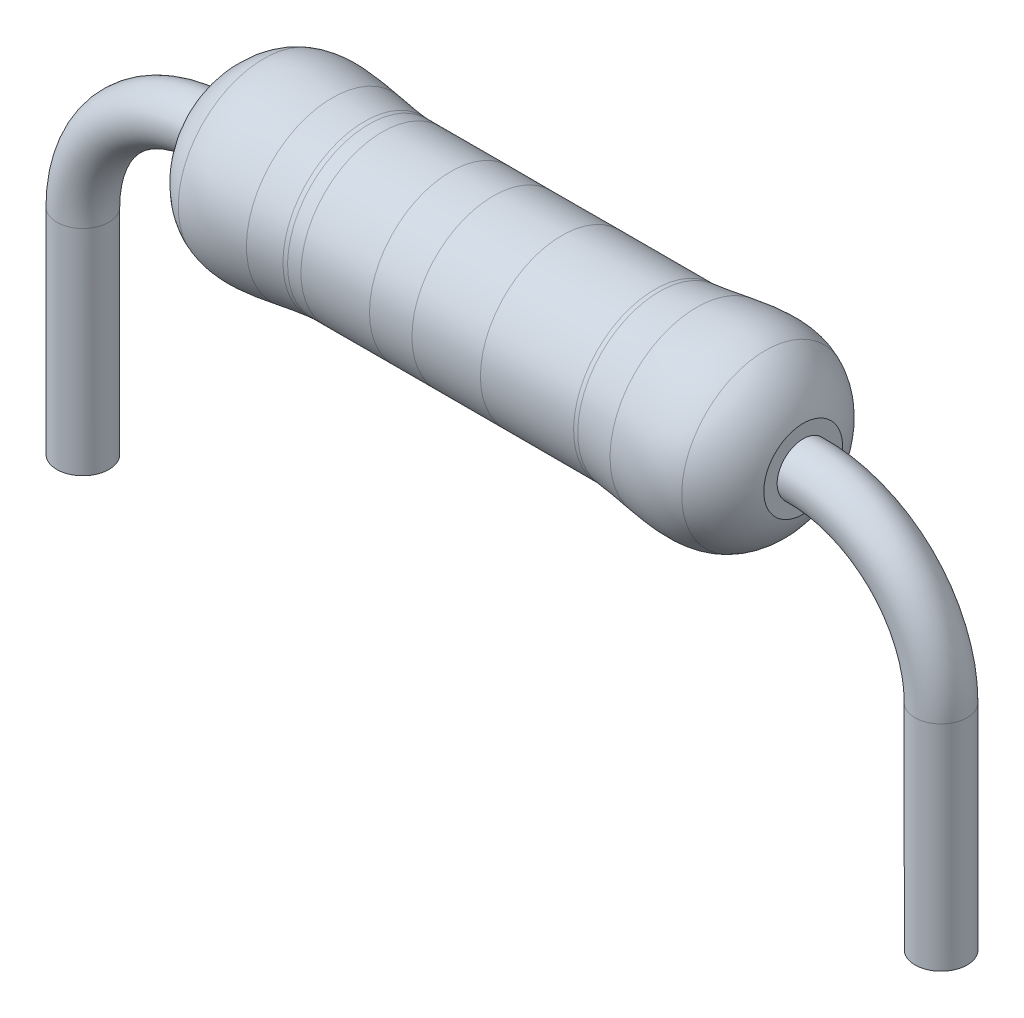
ISO-10303-21;
HEADER;
FILE_DESCRIPTION(('STEP AP214'),'2;1');
FILE_NAME('part.step','',(''),(''),'','','');
FILE_SCHEMA(('AUTOMOTIVE_DESIGN { 1 0 10303 214 1 1 1 1 }'));
ENDSEC;
DATA;
#1=APPLICATION_CONTEXT('core data for automotive mechanical design processes');
#2=APPLICATION_PROTOCOL_DEFINITION('international standard','automotive_design',2000,#1);
#3=PRODUCT_CONTEXT('',#1,'mechanical');
#4=PRODUCT('Part','Part','',(#3));
#5=PRODUCT_RELATED_PRODUCT_CATEGORY('part','',(#4));
#6=PRODUCT_DEFINITION_FORMATION('','',#4);
#7=PRODUCT_DEFINITION_CONTEXT('part definition',#1,'design');
#8=PRODUCT_DEFINITION('design','',#6,#7);
#9=PRODUCT_DEFINITION_SHAPE('','',#8);
#10=(LENGTH_UNIT() NAMED_UNIT(*) SI_UNIT(.MILLI.,.METRE.));
#11=(NAMED_UNIT(*) PLANE_ANGLE_UNIT() SI_UNIT($,.RADIAN.));
#12=(NAMED_UNIT(*) SI_UNIT($,.STERADIAN.) SOLID_ANGLE_UNIT());
#13=UNCERTAINTY_MEASURE_WITH_UNIT(LENGTH_MEASURE(1.E-05),#10,'distance_accuracy_value','');
#14=(GEOMETRIC_REPRESENTATION_CONTEXT(3) GLOBAL_UNCERTAINTY_ASSIGNED_CONTEXT((#13)) GLOBAL_UNIT_ASSIGNED_CONTEXT((#10,
#11,#12)) REPRESENTATION_CONTEXT('',''));
#15=CARTESIAN_POINT('',(0.,0.,0.));
#16=DIRECTION('',(0.,0.,1.));
#17=DIRECTION('',(1.,0.,0.));
#18=AXIS2_PLACEMENT_3D('',#15,#16,#17);
#19=CARTESIAN_POINT('',(-5.00892591003059,-4.05984695559979,0.));
#20=DIRECTION('',(-0.000226892800815695,0.999999974259828,0.));
#21=DIRECTION('',(-0.999999974259828,-0.000226892800815695,0.));
#22=AXIS2_PLACEMENT_3D('',#19,#20,#21);
#23=CYLINDRICAL_SURFACE('',#22,0.3045);
#24=CARTESIAN_POINT('',(-5.00949314203263,-1.55984701995021,0.));
#25=DIRECTION('',(-0.000226892800815696,0.999999974259828,0.));
#26=DIRECTION('',(-0.999999974259828,-0.000226892800815696,0.));
#27=AXIS2_PLACEMENT_3D('',#24,#25,#26);
#28=CIRCLE('',#27,0.3045);
#29=CARTESIAN_POINT('',(-5.31399313419475,-1.55991610880806,0.));
#30=VERTEX_POINT('',#29);
#31=EDGE_CURVE('E13',#30,#30,#28,.T.);
#32=ORIENTED_EDGE('',*,*,#31,.F.);
#33=EDGE_LOOP('',(#32));
#34=FACE_BOUND('',#33,.T.);
#35=CARTESIAN_POINT('',(-5.00892591003059,-4.05984695559979,0.));
#36=DIRECTION('',(0.000226892800815695,-0.999999974259828,0.));
#37=DIRECTION('',(0.999999974259828,0.000226892800815695,0.));
#38=AXIS2_PLACEMENT_3D('',#35,#36,#37);
#39=CIRCLE('',#38,0.3045);
#40=CARTESIAN_POINT('',(-4.70442591786848,-4.05977786674194,0.));
#41=VERTEX_POINT('',#40);
#42=EDGE_CURVE('E113',#41,#41,#39,.T.);
#43=ORIENTED_EDGE('',*,*,#42,.F.);
#44=EDGE_LOOP('',(#43));
#45=FACE_BOUND('',#44,.T.);
#46=ADVANCED_FACE('F101',(#34,#45),#23,.T.);
#47=CARTESIAN_POINT('',(-3.45,-1.55949318217426,0.));
#48=DIRECTION('',(0.,0.,-1.));
#49=DIRECTION('',(0.,1.,0.));
#50=AXIS2_PLACEMENT_3D('',#47,#48,#49);
#51=TOROIDAL_SURFACE('',#50,1.55949318217426,0.3045);
#52=CARTESIAN_POINT('',(-3.40000856583057,-0.000801473799033381,0.));
#53=DIRECTION('',(-0.999486067776253,0.0320562056576163,0.));
#54=DIRECTION('',(-0.0320562056576163,-0.999486067776253,0.));
#55=AXIS2_PLACEMENT_3D('',#52,#53,#54);
#56=CIRCLE('',#55,0.3045);
#57=CARTESIAN_POINT('',(-3.39024745120783,0.303542033838836,0.));
#58=VERTEX_POINT('',#57);
#59=EDGE_CURVE('E105',#58,#58,#56,.T.);
#60=CARTESIAN_POINT('',(-3.45,-1.55949318217426,0.));
#61=DIRECTION('',(0.,0.,-1.));
#62=DIRECTION('',(0.,1.,0.));
#63=AXIS2_PLACEMENT_3D('',#60,#61,#62);
#64=CIRCLE('',#63,1.86399318217426);
#65=EDGE_CURVE('',#30,#58,#64,.T.);
#66=ORIENTED_EDGE('',*,*,#31,.T.);
#67=ORIENTED_EDGE('',*,*,#59,.T.);
#68=ORIENTED_EDGE('',*,*,#65,.T.);
#69=ORIENTED_EDGE('',*,*,#65,.F.);
#70=EDGE_LOOP('',(#66,#68,#67,#69));
#71=FACE_BOUND('',#70,.T.);
#72=ADVANCED_FACE('F122',(#71),#51,.T.);
#73=CARTESIAN_POINT('',(-5.00892591003059,-4.05984695559979,0.));
#74=DIRECTION('',(0.000226892800815695,-0.999999974259828,0.));
#75=DIRECTION('',(0.999999974259828,0.000226892800815695,0.));
#76=AXIS2_PLACEMENT_3D('',#73,#74,#75);
#77=PLANE('',#76);
#78=ORIENTED_EDGE('',*,*,#42,.T.);
#79=EDGE_LOOP('',(#78));
#80=FACE_BOUND('',#79,.T.);
#81=ADVANCED_FACE('F119',(#80),#77,.T.);
#82=CARTESIAN_POINT('',(-3.40000856583057,-0.000801473799033381,0.));
#83=DIRECTION('',(-0.999486067776253,0.0320562056576163,0.));
#84=DIRECTION('',(-0.0320562056576163,-0.999486067776253,0.));
#85=AXIS2_PLACEMENT_3D('',#82,#83,#84);
#86=PLANE('',#85);
#87=ORIENTED_EDGE('',*,*,#59,.F.);
#88=EDGE_LOOP('',(#87));
#89=FACE_BOUND('',#88,.T.);
#90=ADVANCED_FACE('F103',(#89),#86,.F.);
#91=CLOSED_SHELL('',(#46,#72,#81,#90));
#92=MANIFOLD_SOLID_BREP('B2',#91);
#93=CARTESIAN_POINT('',(3.45,-1.56000270946096,0.));
#94=DIRECTION('',(0.,0.,-1.));
#95=DIRECTION('',(0.,1.,0.));
#96=AXIS2_PLACEMENT_3D('',#93,#94,#95);
#97=TOROIDAL_SURFACE('',#96,1.56000270946096,0.3045);
#98=CARTESIAN_POINT('',(3.40000856023624,-0.000801212066898596,0.));
#99=DIRECTION('',(0.999486403413251,0.0320457390622326,0.));
#100=DIRECTION('',(-0.0320457390622326,0.999486403413251,0.));
#101=AXIS2_PLACEMENT_3D('',#98,#99,#100);
#102=CIRCLE('',#101,0.3045);
#103=CARTESIAN_POINT('',(3.39025063269179,0.303542397772436,0.));
#104=VERTEX_POINT('',#103);
#105=EDGE_CURVE('E175',#104,#104,#102,.T.);
#106=CARTESIAN_POINT('',(5.01000264555553,-1.55955618365569,0.));
#107=DIRECTION('',(0.000286233993415575,-0.99999995903505,0.));
#108=DIRECTION('',(0.99999995903505,0.000286233993415575,0.));
#109=AXIS2_PLACEMENT_3D('',#106,#107,#108);
#110=CIRCLE('',#109,0.3045);
#111=CARTESIAN_POINT('',(5.3145026330817,-1.5594690254047,0.));
#112=VERTEX_POINT('',#111);
#113=EDGE_CURVE('E100',#112,#112,#110,.T.);
#114=CARTESIAN_POINT('',(3.45,-1.56000270946096,0.));
#115=DIRECTION('',(0.,0.,-1.));
#116=DIRECTION('',(0.,1.,0.));
#117=AXIS2_PLACEMENT_3D('',#114,#115,#116);
#118=CIRCLE('',#117,1.86450270946096);
#119=EDGE_CURVE('',#104,#112,#118,.T.);
#120=ORIENTED_EDGE('',*,*,#105,.T.);
#121=ORIENTED_EDGE('',*,*,#113,.F.);
#122=ORIENTED_EDGE('',*,*,#119,.T.);
#123=ORIENTED_EDGE('',*,*,#119,.F.);
#124=EDGE_LOOP('',(#120,#122,#121,#123));
#125=FACE_BOUND('',#124,.T.);
#126=ADVANCED_FACE('F171',(#125),#97,.T.);
#127=CARTESIAN_POINT('',(5.01071823053907,-4.05955608124332,0.));
#128=DIRECTION('',(-0.000286233993415575,0.99999995903505,0.));
#129=DIRECTION('',(-0.99999995903505,-0.000286233993415575,0.));
#130=AXIS2_PLACEMENT_3D('',#127,#128,#129);
#131=CYLINDRICAL_SURFACE('',#130,0.3045);
#132=ORIENTED_EDGE('',*,*,#113,.T.);
#133=EDGE_LOOP('',(#132));
#134=FACE_BOUND('',#133,.T.);
#135=CARTESIAN_POINT('',(5.01071823053907,-4.05955608124332,0.));
#136=DIRECTION('',(0.000286233993415575,-0.99999995903505,0.));
#137=DIRECTION('',(0.99999995903505,0.000286233993415575,0.));
#138=AXIS2_PLACEMENT_3D('',#135,#136,#137);
#139=CIRCLE('',#138,0.3045);
#140=CARTESIAN_POINT('',(5.31521821806524,-4.05946892299232,0.));
#141=VERTEX_POINT('',#140);
#142=EDGE_CURVE('E183',#141,#141,#139,.T.);
#143=ORIENTED_EDGE('',*,*,#142,.F.);
#144=EDGE_LOOP('',(#143));
#145=FACE_BOUND('',#144,.T.);
#146=ADVANCED_FACE('F191',(#134,#145),#131,.T.);
#147=CARTESIAN_POINT('',(5.01071823053907,-4.05955608124332,0.));
#148=DIRECTION('',(0.000286233993415575,-0.99999995903505,0.));
#149=DIRECTION('',(0.99999995903505,0.000286233993415575,0.));
#150=AXIS2_PLACEMENT_3D('',#147,#148,#149);
#151=PLANE('',#150);
#152=ORIENTED_EDGE('',*,*,#142,.T.);
#153=EDGE_LOOP('',(#152));
#154=FACE_BOUND('',#153,.T.);
#155=ADVANCED_FACE('F189',(#154),#151,.T.);
#156=CARTESIAN_POINT('',(3.40000856023624,-0.000801212066898596,0.));
#157=DIRECTION('',(0.999486403413251,0.0320457390622326,0.));
#158=DIRECTION('',(-0.0320457390622326,0.999486403413251,0.));
#159=AXIS2_PLACEMENT_3D('',#156,#157,#158);
#160=PLANE('',#159);
#161=ORIENTED_EDGE('',*,*,#105,.F.);
#162=EDGE_LOOP('',(#161));
#163=FACE_BOUND('',#162,.T.);
#164=ADVANCED_FACE('F173',(#163),#160,.F.);
#165=CLOSED_SHELL('',(#126,#146,#155,#164));
#166=MANIFOLD_SOLID_BREP('B8',#165);
#167=CARTESIAN_POINT('',(3.4,0.459698721559316,0.));
#168=CARTESIAN_POINT('',(3.33480124099808,0.661458026472629,0.));
#169=CARTESIAN_POINT('',(2.9210288170177,1.17428294435679,0.));
#170=CARTESIAN_POINT('',(2.23696045473549,1.01348401585843,0.));
#171=CARTESIAN_POINT('',(1.79369150074186,0.96011017829571,0.));
#172=CARTESIAN_POINT('',(1.72057233266166,0.952609891627737,0.));
#173=B_SPLINE_CURVE_WITH_KNOTS('',3,(#167,#168,#169,#170,#171,#172),.UNSPECIFIED.,.F.,.F.,(4,1,
1,4),(0.113048735519724,0.262639928880179,0.524150914852832,0.576222934190611),.UNSPECIFIED.);
#174=CARTESIAN_POINT('',(-3.4,0.,0.));
#175=DIRECTION('',(-1.,0.,0.));
#176=AXIS1_PLACEMENT('',#174,#175);
#177=SURFACE_OF_REVOLUTION('',#173,#176);
#178=CARTESIAN_POINT('',(1.72057233266166,0.,0.));
#179=DIRECTION('',(-1.,0.,0.));
#180=DIRECTION('',(0.,-1.,0.));
#181=AXIS2_PLACEMENT_3D('',#178,#179,#180);
#182=CIRCLE('',#181,0.952609891627737);
#183=CARTESIAN_POINT('',(1.72057233266166,-0.952609891627738,0.));
#184=VERTEX_POINT('',#183);
#185=EDGE_CURVE('E294',#184,#184,#182,.T.);
#186=ORIENTED_EDGE('',*,*,#185,.F.);
#187=EDGE_LOOP('',(#186));
#188=FACE_BOUND('',#187,.T.);
#189=CARTESIAN_POINT('',(2.15639241007237,0.,0.));
#190=DIRECTION('',(-1.,0.,0.));
#191=DIRECTION('',(0.,-1.,0.));
#192=AXIS2_PLACEMENT_3D('',#189,#190,#191);
#193=CIRCLE('',#192,1.0114815434762);
#194=CARTESIAN_POINT('',(2.15639241007237,-1.0114815434762,0.));
#195=VERTEX_POINT('',#194);
#196=EDGE_CURVE('E170',#195,#195,#193,.F.);
#197=ORIENTED_EDGE('',*,*,#196,.F.);
#198=EDGE_LOOP('',(#197));
#199=FACE_BOUND('',#198,.T.);
#200=ADVANCED_FACE('F247',(#188,#199),#177,.T.);
#201=CARTESIAN_POINT('',(3.4,0.,0.));
#202=DIRECTION('',(-1.,0.,0.));
#203=DIRECTION('',(0.,-1.,0.));
#204=AXIS2_PLACEMENT_3D('',#201,#202,#203);
#205=CIRCLE('',#204,0.459698721559316);
#206=CARTESIAN_POINT('',(3.4,-0.459698721559316,0.));
#207=VERTEX_POINT('',#206);
#208=EDGE_CURVE('E291',#207,#207,#205,.T.);
#209=ORIENTED_EDGE('',*,*,#208,.T.);
#210=EDGE_LOOP('',(#209));
#211=FACE_BOUND('',#210,.T.);
#212=CARTESIAN_POINT('',(2.95639241007237,0.,0.));
#213=DIRECTION('',(-1.,0.,0.));
#214=DIRECTION('',(0.,-1.,0.));
#215=AXIS2_PLACEMENT_3D('',#212,#213,#214);
#216=CIRCLE('',#215,0.974379803430076);
#217=CARTESIAN_POINT('',(2.95639241007237,-0.974379803430076,0.));
#218=VERTEX_POINT('',#217);
#219=EDGE_CURVE('E255',#218,#218,#216,.T.);
#220=ORIENTED_EDGE('',*,*,#219,.F.);
#221=EDGE_LOOP('',(#220));
#222=FACE_BOUND('',#221,.T.);
#223=ADVANCED_FACE('F325',(#211,#222),#177,.T.);
#224=CARTESIAN_POINT('',(-3.4,0.,0.));
#225=DIRECTION('',(-1.,0.,0.));
#226=DIRECTION('',(0.,-1.,0.));
#227=AXIS2_PLACEMENT_3D('',#224,#225,#226);
#228=CYLINDRICAL_SURFACE('',#227,0.95);
#229=CARTESIAN_POINT('',(-0.713053943157984,0.,0.));
#230=DIRECTION('',(-1.,0.,0.));
#231=DIRECTION('',(0.,0.,1.));
#232=AXIS2_PLACEMENT_3D('',#229,#230,#231);
#233=CIRCLE('',#232,0.95);
#234=CARTESIAN_POINT('',(-0.713053943157983,0.,0.95));
#235=VERTEX_POINT('',#234);
#236=EDGE_CURVE('E279',#235,#235,#233,.T.);
#237=ORIENTED_EDGE('',*,*,#236,.F.);
#238=EDGE_LOOP('',(#237));
#239=FACE_BOUND('',#238,.T.);
#240=CARTESIAN_POINT('',(-0.217785278190086,0.,0.));
#241=DIRECTION('',(1.,0.,0.));
#242=DIRECTION('',(0.,0.,-1.));
#243=AXIS2_PLACEMENT_3D('',#240,#241,#242);
#244=CIRCLE('',#243,0.95);
#245=CARTESIAN_POINT('',(-0.217785278190086,0.,-0.95));
#246=VERTEX_POINT('',#245);
#247=EDGE_CURVE('E263',#246,#246,#244,.T.);
#248=ORIENTED_EDGE('',*,*,#247,.F.);
#249=EDGE_LOOP('',(#248));
#250=FACE_BOUND('',#249,.T.);
#251=ADVANCED_FACE('F340',(#239,#250),#228,.T.);
#252=CARTESIAN_POINT('',(1.66955194366443,0.,0.));
#253=DIRECTION('',(-1.,0.,0.));
#254=DIRECTION('',(0.,-1.,0.));
#255=AXIS2_PLACEMENT_3D('',#252,#253,#254);
#256=CIRCLE('',#255,0.95);
#257=CARTESIAN_POINT('',(1.66955194366443,-0.95,0.));
#258=VERTEX_POINT('',#257);
#259=EDGE_CURVE('E297',#258,#258,#256,.T.);
#260=ORIENTED_EDGE('',*,*,#259,.T.);
#261=EDGE_LOOP('',(#260));
#262=FACE_BOUND('',#261,.T.);
#263=CARTESIAN_POINT('',(0.582214721809917,0.,0.));
#264=DIRECTION('',(-1.,0.,0.));
#265=DIRECTION('',(0.,0.,1.));
#266=AXIS2_PLACEMENT_3D('',#263,#264,#265);
#267=CIRCLE('',#266,0.95);
#268=CARTESIAN_POINT('',(0.582214721809918,0.,0.95));
#269=VERTEX_POINT('',#268);
#270=EDGE_CURVE('E270',#269,#269,#267,.T.);
#271=ORIENTED_EDGE('',*,*,#270,.F.);
#272=EDGE_LOOP('',(#271));
#273=FACE_BOUND('',#272,.T.);
#274=ADVANCED_FACE('F350',(#262,#273),#228,.T.);
#275=CARTESIAN_POINT('',(-1.66955194366443,0.,0.));
#276=DIRECTION('',(-1.,0.,0.));
#277=DIRECTION('',(0.,-1.,0.));
#278=AXIS2_PLACEMENT_3D('',#275,#276,#277);
#279=CIRCLE('',#278,0.95);
#280=CARTESIAN_POINT('',(-1.66955194366443,-0.950000000000001,0.));
#281=VERTEX_POINT('',#280);
#282=EDGE_CURVE('E300',#281,#281,#279,.T.);
#283=ORIENTED_EDGE('',*,*,#282,.F.);
#284=EDGE_LOOP('',(#283));
#285=FACE_BOUND('',#284,.T.);
#286=CARTESIAN_POINT('',(-1.51305394315799,0.,0.));
#287=DIRECTION('',(1.,0.,0.));
#288=DIRECTION('',(0.,0.,-1.));
#289=AXIS2_PLACEMENT_3D('',#286,#287,#288);
#290=CIRCLE('',#289,0.95);
#291=CARTESIAN_POINT('',(-1.51305394315799,0.,-0.95));
#292=VERTEX_POINT('',#291);
#293=EDGE_CURVE('E275',#292,#292,#290,.T.);
#294=ORIENTED_EDGE('',*,*,#293,.F.);
#295=EDGE_LOOP('',(#294));
#296=FACE_BOUND('',#295,.T.);
#297=ADVANCED_FACE('F353',(#285,#296),#228,.T.);
#298=ORIENTED_EDGE('',*,*,#247,.T.);
#299=EDGE_LOOP('',(#298));
#300=FACE_BOUND('',#299,.T.);
#301=ORIENTED_EDGE('',*,*,#270,.T.);
#302=EDGE_LOOP('',(#301));
#303=FACE_BOUND('',#302,.T.);
#304=ADVANCED_FACE('F356',(#300,#303),#228,.T.);
#305=CARTESIAN_POINT('',(-3.4,0.459698721559316,0.));
#306=CARTESIAN_POINT('',(-3.33480124099808,0.661458026472629,0.));
#307=CARTESIAN_POINT('',(-2.9210288170177,1.17428294435679,0.));
#308=CARTESIAN_POINT('',(-2.23696045473549,1.01348401585843,0.));
#309=CARTESIAN_POINT('',(-1.79369150074186,0.96011017829571,0.));
#310=CARTESIAN_POINT('',(-1.72057233266166,0.952609891627737,0.));
#311=B_SPLINE_CURVE_WITH_KNOTS('',3,(#305,#306,#307,#308,#309,#310),.UNSPECIFIED.,.F.,.F.,(4,1,
1,4),(0.113048735519724,0.262639928880179,0.524150914852832,0.576222934190611),.UNSPECIFIED.);
#312=CARTESIAN_POINT('',(-3.4,0.,0.));
#313=DIRECTION('',(-1.,0.,0.));
#314=AXIS1_PLACEMENT('',#312,#313);
#315=SURFACE_OF_REVOLUTION('',#311,#314);
#316=CARTESIAN_POINT('',(-3.4,0.,0.));
#317=DIRECTION('',(-1.,0.,0.));
#318=DIRECTION('',(0.,-1.,0.));
#319=AXIS2_PLACEMENT_3D('',#316,#317,#318);
#320=CIRCLE('',#319,0.459698721559316);
#321=CARTESIAN_POINT('',(-3.4,-0.459698721559317,0.));
#322=VERTEX_POINT('',#321);
#323=EDGE_CURVE('E306',#322,#322,#320,.T.);
#324=ORIENTED_EDGE('',*,*,#323,.F.);
#325=EDGE_LOOP('',(#324));
#326=FACE_BOUND('',#325,.T.);
#327=CARTESIAN_POINT('',(-2.89733610036465,0.,0.));
#328=DIRECTION('',(-1.,0.,0.));
#329=DIRECTION('',(0.,-1.,0.));
#330=AXIS2_PLACEMENT_3D('',#327,#328,#329);
#331=CIRCLE('',#330,0.998550705317885);
#332=CARTESIAN_POINT('',(-2.89733610036465,-0.998550705317886,0.));
#333=VERTEX_POINT('',#332);
#334=EDGE_CURVE('E283',#333,#333,#331,.T.);
#335=ORIENTED_EDGE('',*,*,#334,.T.);
#336=EDGE_LOOP('',(#335));
#337=FACE_BOUND('',#336,.T.);
#338=ADVANCED_FACE('F358',(#326,#337),#315,.F.);
#339=CARTESIAN_POINT('',(-1.72057233266166,0.,0.));
#340=DIRECTION('',(-1.,0.,0.));
#341=DIRECTION('',(0.,-1.,0.));
#342=AXIS2_PLACEMENT_3D('',#339,#340,#341);
#343=CIRCLE('',#342,0.952609891627738);
#344=CARTESIAN_POINT('',(-1.72057233266166,-0.952609891627738,0.));
#345=VERTEX_POINT('',#344);
#346=EDGE_CURVE('E303',#345,#345,#343,.T.);
#347=ORIENTED_EDGE('',*,*,#346,.T.);
#348=EDGE_LOOP('',(#347));
#349=FACE_BOUND('',#348,.T.);
#350=CARTESIAN_POINT('',(-2.09733610036464,0.,0.));
#351=DIRECTION('',(-1.,0.,0.));
#352=DIRECTION('',(0.,-1.,0.));
#353=AXIS2_PLACEMENT_3D('',#350,#351,#352);
#354=CIRCLE('',#353,1.00255771486506);
#355=CARTESIAN_POINT('',(-2.09733610036464,-1.00255771486506,0.));
#356=VERTEX_POINT('',#355);
#357=EDGE_CURVE('E287',#356,#356,#354,.F.);
#358=ORIENTED_EDGE('',*,*,#357,.T.);
#359=EDGE_LOOP('',(#358));
#360=FACE_BOUND('',#359,.T.);
#361=ADVANCED_FACE('F332',(#349,#360),#315,.F.);
#362=CARTESIAN_POINT('',(-3.4,0.,0.));
#363=DIRECTION('',(-1.,0.,0.));
#364=DIRECTION('',(0.,-1.,0.));
#365=AXIS2_PLACEMENT_3D('',#362,#363,#364);
#366=PLANE('',#365);
#367=ORIENTED_EDGE('',*,*,#323,.T.);
#368=EDGE_LOOP('',(#367));
#369=FACE_BOUND('',#368,.T.);
#370=ADVANCED_FACE('F249',(#369),#366,.T.);
#371=CARTESIAN_POINT('',(3.4,0.,0.));
#372=DIRECTION('',(-1.,0.,0.));
#373=DIRECTION('',(0.,-1.,0.));
#374=AXIS2_PLACEMENT_3D('',#371,#372,#373);
#375=PLANE('',#374);
#376=ORIENTED_EDGE('',*,*,#208,.F.);
#377=EDGE_LOOP('',(#376));
#378=FACE_BOUND('',#377,.T.);
#379=ADVANCED_FACE('F324',(#378),#375,.F.);
#380=ORIENTED_EDGE('',*,*,#196,.T.);
#381=EDGE_LOOP('',(#380));
#382=FACE_BOUND('',#381,.T.);
#383=ORIENTED_EDGE('',*,*,#219,.T.);
#384=EDGE_LOOP('',(#383));
#385=FACE_BOUND('',#384,.T.);
#386=ADVANCED_FACE('F320',(#382,#385),#177,.T.);
#387=CARTESIAN_POINT('',(1.66955194366443,0.,0.));
#388=DIRECTION('',(-1.,0.,0.));
#389=DIRECTION('',(0.,-1.,0.));
#390=AXIS2_PLACEMENT_3D('',#387,#388,#389);
#391=TOROIDAL_SURFACE('',#390,1.45,0.5);
#392=ORIENTED_EDGE('',*,*,#185,.T.);
#393=EDGE_LOOP('',(#392));
#394=FACE_BOUND('',#393,.T.);
#395=ORIENTED_EDGE('',*,*,#259,.F.);
#396=EDGE_LOOP('',(#395));
#397=FACE_BOUND('',#396,.T.);
#398=ADVANCED_FACE('F323',(#394,#397),#391,.F.);
#399=ORIENTED_EDGE('',*,*,#293,.T.);
#400=EDGE_LOOP('',(#399));
#401=FACE_BOUND('',#400,.T.);
#402=ORIENTED_EDGE('',*,*,#236,.T.);
#403=EDGE_LOOP('',(#402));
#404=FACE_BOUND('',#403,.T.);
#405=ADVANCED_FACE('F347',(#401,#404),#228,.T.);
#406=CARTESIAN_POINT('',(-1.66955194366443,0.,0.));
#407=DIRECTION('',(-1.,0.,0.));
#408=DIRECTION('',(0.,-1.,0.));
#409=AXIS2_PLACEMENT_3D('',#406,#407,#408);
#410=TOROIDAL_SURFACE('',#409,1.45,0.5);
#411=ORIENTED_EDGE('',*,*,#346,.F.);
#412=EDGE_LOOP('',(#411));
#413=FACE_BOUND('',#412,.T.);
#414=ORIENTED_EDGE('',*,*,#282,.T.);
#415=EDGE_LOOP('',(#414));
#416=FACE_BOUND('',#415,.T.);
#417=ADVANCED_FACE('F370',(#413,#416),#410,.F.);
#418=ORIENTED_EDGE('',*,*,#334,.F.);
#419=EDGE_LOOP('',(#418));
#420=FACE_BOUND('',#419,.T.);
#421=ORIENTED_EDGE('',*,*,#357,.F.);
#422=EDGE_LOOP('',(#421));
#423=FACE_BOUND('',#422,.T.);
#424=ADVANCED_FACE('F366',(#420,#423),#315,.F.);
#425=CLOSED_SHELL('',(#200,#223,#251,#274,#297,#304,#338,#361,#370,#379,#386,#398,#405,#417,#424));
#426=MANIFOLD_SOLID_BREP('B95',#425);
#427=ADVANCED_BREP_SHAPE_REPRESENTATION('',(#18,#92,#166,#426),#14);
#428=SHAPE_DEFINITION_REPRESENTATION(#9,#427);
ENDSEC;
END-ISO-10303-21;
